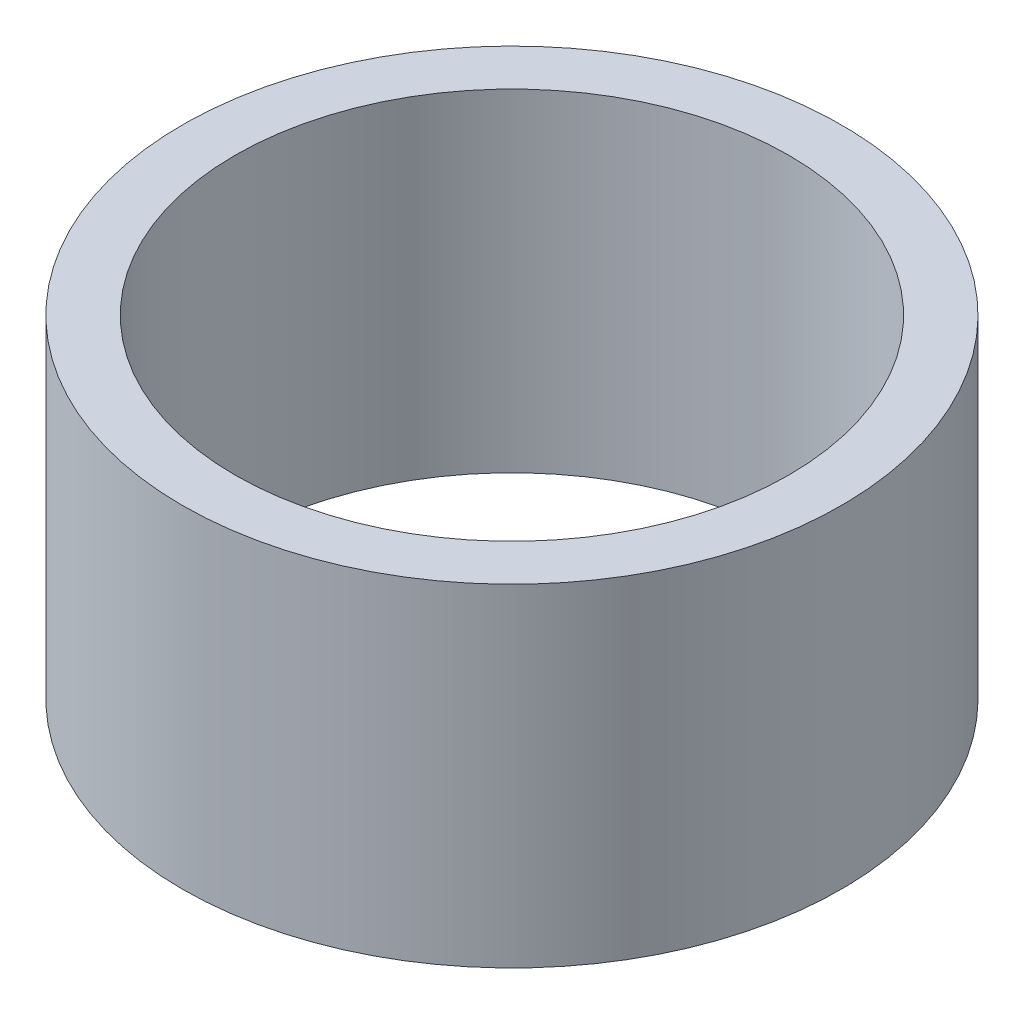
ISO-10303-21;
HEADER;
FILE_DESCRIPTION(('STEP AP214'),'2;1');
FILE_NAME('part.step','',(''),(''),'','','');
FILE_SCHEMA(('AUTOMOTIVE_DESIGN { 1 0 10303 214 1 1 1 1 }'));
ENDSEC;
DATA;
#1=APPLICATION_CONTEXT('core data for automotive mechanical design processes');
#2=APPLICATION_PROTOCOL_DEFINITION('international standard','automotive_design',2000,#1);
#3=PRODUCT_CONTEXT('',#1,'mechanical');
#4=PRODUCT('Part','Part','',(#3));
#5=PRODUCT_RELATED_PRODUCT_CATEGORY('part','',(#4));
#6=PRODUCT_DEFINITION_FORMATION('','',#4);
#7=PRODUCT_DEFINITION_CONTEXT('part definition',#1,'design');
#8=PRODUCT_DEFINITION('design','',#6,#7);
#9=PRODUCT_DEFINITION_SHAPE('','',#8);
#10=(LENGTH_UNIT() NAMED_UNIT(*) SI_UNIT(.MILLI.,.METRE.));
#11=(NAMED_UNIT(*) PLANE_ANGLE_UNIT() SI_UNIT($,.RADIAN.));
#12=(NAMED_UNIT(*) SI_UNIT($,.STERADIAN.) SOLID_ANGLE_UNIT());
#13=UNCERTAINTY_MEASURE_WITH_UNIT(LENGTH_MEASURE(1.E-05),#10,'distance_accuracy_value','');
#14=(GEOMETRIC_REPRESENTATION_CONTEXT(3) GLOBAL_UNCERTAINTY_ASSIGNED_CONTEXT((#13)) GLOBAL_UNIT_ASSIGNED_CONTEXT((#10,
#11,#12)) REPRESENTATION_CONTEXT('',''));
#15=CARTESIAN_POINT('',(0.,0.,0.));
#16=DIRECTION('',(0.,0.,1.));
#17=DIRECTION('',(1.,0.,0.));
#18=AXIS2_PLACEMENT_3D('',#15,#16,#17);
#19=CARTESIAN_POINT('',(0.,-76.2,0.));
#20=DIRECTION('',(0.,1.,0.));
#21=DIRECTION('',(0.,0.,1.));
#22=AXIS2_PLACEMENT_3D('',#19,#20,#21);
#23=CYLINDRICAL_SURFACE('',#22,75.565);
#24=CARTESIAN_POINT('',(0.,-76.2,0.));
#25=DIRECTION('',(0.,1.,0.));
#26=DIRECTION('',(0.,0.,1.));
#27=AXIS2_PLACEMENT_3D('',#24,#25,#26);
#28=CIRCLE('',#27,75.565);
#29=CARTESIAN_POINT('',(0.,-76.2,75.565));
#30=VERTEX_POINT('',#29);
#31=EDGE_CURVE('E10',#30,#30,#28,.T.);
#32=CARTESIAN_POINT('',(0.,0.,0.));
#33=DIRECTION('',(0.,1.,0.));
#34=DIRECTION('',(0.,0.,1.));
#35=AXIS2_PLACEMENT_3D('',#32,#33,#34);
#36=CIRCLE('',#35,75.565);
#37=CARTESIAN_POINT('',(0.,0.,75.565));
#38=VERTEX_POINT('',#37);
#39=EDGE_CURVE('E40',#38,#38,#36,.T.);
#40=CARTESIAN_POINT('',(0.,-76.2,75.565));
#41=CARTESIAN_POINT('',(0.,-75.40625,75.565));
#42=CARTESIAN_POINT('',(0.,-74.6125,75.565));
#43=CARTESIAN_POINT('',(0.,-73.025,75.565));
#44=CARTESIAN_POINT('',(0.,-72.23125,75.565));
#45=CARTESIAN_POINT('',(0.,-70.64375,75.565));
#46=CARTESIAN_POINT('',(0.,-69.85,75.565));
#47=CARTESIAN_POINT('',(0.,-68.2625,75.565));
#48=CARTESIAN_POINT('',(0.,-67.46875,75.565));
#49=CARTESIAN_POINT('',(0.,-65.88125,75.565));
#50=CARTESIAN_POINT('',(0.,-65.0875,75.565));
#51=CARTESIAN_POINT('',(0.,-63.5,75.565));
#52=CARTESIAN_POINT('',(0.,-62.70625,75.565));
#53=CARTESIAN_POINT('',(0.,-61.11875,75.565));
#54=CARTESIAN_POINT('',(0.,-60.325,75.565));
#55=CARTESIAN_POINT('',(0.,-58.7375,75.565));
#56=CARTESIAN_POINT('',(0.,-57.94375,75.565));
#57=CARTESIAN_POINT('',(0.,-56.35625,75.565));
#58=CARTESIAN_POINT('',(0.,-55.5625,75.565));
#59=CARTESIAN_POINT('',(0.,-53.975,75.565));
#60=CARTESIAN_POINT('',(0.,-53.18125,75.565));
#61=CARTESIAN_POINT('',(0.,-51.59375,75.565));
#62=CARTESIAN_POINT('',(0.,-50.8,75.565));
#63=CARTESIAN_POINT('',(0.,-49.2125,75.565));
#64=CARTESIAN_POINT('',(0.,-48.41875,75.565));
#65=CARTESIAN_POINT('',(0.,-46.83125,75.565));
#66=CARTESIAN_POINT('',(0.,-46.0375,75.565));
#67=CARTESIAN_POINT('',(0.,-44.45,75.565));
#68=CARTESIAN_POINT('',(0.,-43.65625,75.565));
#69=CARTESIAN_POINT('',(0.,-42.06875,75.565));
#70=CARTESIAN_POINT('',(0.,-41.275,75.565));
#71=CARTESIAN_POINT('',(0.,-39.6875,75.565));
#72=CARTESIAN_POINT('',(0.,-38.89375,75.565));
#73=CARTESIAN_POINT('',(0.,-37.30625,75.565));
#74=CARTESIAN_POINT('',(0.,-36.5125,75.565));
#75=CARTESIAN_POINT('',(0.,-34.925,75.565));
#76=CARTESIAN_POINT('',(0.,-34.13125,75.565));
#77=CARTESIAN_POINT('',(0.,-32.54375,75.565));
#78=CARTESIAN_POINT('',(0.,-31.75,75.565));
#79=CARTESIAN_POINT('',(0.,-30.1625,75.565));
#80=CARTESIAN_POINT('',(0.,-29.36875,75.565));
#81=CARTESIAN_POINT('',(0.,-27.78125,75.565));
#82=CARTESIAN_POINT('',(0.,-26.9875,75.565));
#83=CARTESIAN_POINT('',(0.,-25.4,75.565));
#84=CARTESIAN_POINT('',(0.,-24.60625,75.565));
#85=CARTESIAN_POINT('',(0.,-23.01875,75.565));
#86=CARTESIAN_POINT('',(0.,-22.225,75.565));
#87=CARTESIAN_POINT('',(0.,-20.6375,75.565));
#88=CARTESIAN_POINT('',(0.,-19.84375,75.565));
#89=CARTESIAN_POINT('',(0.,-18.25625,75.565));
#90=CARTESIAN_POINT('',(0.,-17.4625,75.565));
#91=CARTESIAN_POINT('',(0.,-15.875,75.565));
#92=CARTESIAN_POINT('',(0.,-15.08125,75.565));
#93=CARTESIAN_POINT('',(0.,-13.49375,75.565));
#94=CARTESIAN_POINT('',(0.,-12.7,75.565));
#95=CARTESIAN_POINT('',(0.,-11.1125,75.565));
#96=CARTESIAN_POINT('',(0.,-10.31875,75.565));
#97=CARTESIAN_POINT('',(0.,-8.73125,75.565));
#98=CARTESIAN_POINT('',(0.,-7.93750000000001,75.565));
#99=CARTESIAN_POINT('',(0.,-6.35,75.565));
#100=CARTESIAN_POINT('',(0.,-5.55625,75.565));
#101=CARTESIAN_POINT('',(0.,-3.96875,75.565));
#102=CARTESIAN_POINT('',(0.,-3.175,75.565));
#103=CARTESIAN_POINT('',(0.,-1.5875,75.565));
#104=CARTESIAN_POINT('',(0.,-0.793750000000001,75.565));
#105=CARTESIAN_POINT('',(0.,0.,75.565));
#106=B_SPLINE_CURVE_WITH_KNOTS('',3,(#40,#41,#42,#43,#44,#45,#46,#47,#48,#49,#50,#51,#52,#53,
#54,#55,#56,#57,#58,#59,#60,#61,#62,#63,#64,#65,#66,#67,#68,#69,#70,#71,#72,#73,#74,#75,#76,#77,
#78,#79,#80,#81,#82,#83,#84,#85,#86,#87,#88,#89,#90,#91,#92,#93,#94,#95,#96,#97,#98,#99,#100,
#101,#102,#103,#104,#105),.UNSPECIFIED.,.F.,.F.,(4,2,2,2,2,2,2,2,2,2,2,2,2,2,2,2,2,2,2,2,2,2,2,
2,2,2,2,2,2,2,2,2,4),(0.,2.38124999999999,4.76249999999999,7.14374999999999,9.52499999999999,
11.90625,14.2875,16.66875,19.05,21.43125,23.8125,26.19375,28.575,30.95625,33.3375,35.71875,38.1,
40.48125,42.8625,45.24375,47.625,50.00625,52.3875,54.76875,57.15,59.53125,61.9125,64.29375,
66.675,69.05625,71.4375,73.81875,76.2),.UNSPECIFIED.);
#107=EDGE_CURVE('BSEAM37',#30,#38,#106,.T.);
#108=ORIENTED_EDGE('',*,*,#31,.T.);
#109=ORIENTED_EDGE('',*,*,#39,.F.);
#110=ORIENTED_EDGE('',*,*,#107,.T.);
#111=ORIENTED_EDGE('',*,*,#107,.F.);
#112=EDGE_LOOP('',(#108,#110,#109,#111));
#113=FACE_BOUND('',#112,.T.);
#114=ADVANCED_FACE('F37',(#113),#23,.T.);
#115=CARTESIAN_POINT('',(0.,-76.2,0.));
#116=DIRECTION('',(0.,1.,0.));
#117=DIRECTION('',(0.,0.,1.));
#118=AXIS2_PLACEMENT_3D('',#115,#116,#117);
#119=PLANE('',#118);
#120=CARTESIAN_POINT('',(0.,-76.2,0.));
#121=DIRECTION('',(0.,1.,0.));
#122=DIRECTION('',(0.,0.,1.));
#123=AXIS2_PLACEMENT_3D('',#120,#121,#122);
#124=CIRCLE('',#123,63.5);
#125=CARTESIAN_POINT('',(0.,-76.2,63.5));
#126=VERTEX_POINT('',#125);
#127=EDGE_CURVE('E49',#126,#126,#124,.T.);
#128=ORIENTED_EDGE('',*,*,#127,.T.);
#129=EDGE_LOOP('',(#128));
#130=FACE_BOUND('',#129,.T.);
#131=ORIENTED_EDGE('',*,*,#31,.F.);
#132=EDGE_LOOP('',(#131));
#133=FACE_BOUND('',#132,.T.);
#134=ADVANCED_FACE('F59',(#130,#133),#119,.F.);
#135=CARTESIAN_POINT('',(0.,0.,0.));
#136=DIRECTION('',(0.,1.,0.));
#137=DIRECTION('',(0.,0.,1.));
#138=AXIS2_PLACEMENT_3D('',#135,#136,#137);
#139=PLANE('',#138);
#140=CARTESIAN_POINT('',(0.,0.,0.));
#141=DIRECTION('',(0.,1.,0.));
#142=DIRECTION('',(0.,0.,1.));
#143=AXIS2_PLACEMENT_3D('',#140,#141,#142);
#144=CIRCLE('',#143,63.5);
#145=CARTESIAN_POINT('',(0.,0.,63.5));
#146=VERTEX_POINT('',#145);
#147=EDGE_CURVE('E51',#146,#146,#144,.T.);
#148=ORIENTED_EDGE('',*,*,#147,.F.);
#149=EDGE_LOOP('',(#148));
#150=FACE_BOUND('',#149,.T.);
#151=ORIENTED_EDGE('',*,*,#39,.T.);
#152=EDGE_LOOP('',(#151));
#153=FACE_BOUND('',#152,.T.);
#154=ADVANCED_FACE('F65',(#150,#153),#139,.T.);
#155=CARTESIAN_POINT('',(0.,-76.2,0.));
#156=DIRECTION('',(0.,1.,0.));
#157=DIRECTION('',(0.,0.,1.));
#158=AXIS2_PLACEMENT_3D('',#155,#156,#157);
#159=CYLINDRICAL_SURFACE('',#158,63.5);
#160=CARTESIAN_POINT('',(0.,-76.2,63.5));
#161=CARTESIAN_POINT('',(0.,-75.40625,63.5));
#162=CARTESIAN_POINT('',(0.,-74.6125,63.5));
#163=CARTESIAN_POINT('',(0.,-73.025,63.5));
#164=CARTESIAN_POINT('',(0.,-72.23125,63.5));
#165=CARTESIAN_POINT('',(0.,-70.64375,63.5));
#166=CARTESIAN_POINT('',(0.,-69.85,63.5));
#167=CARTESIAN_POINT('',(0.,-68.2625,63.5));
#168=CARTESIAN_POINT('',(0.,-67.46875,63.5));
#169=CARTESIAN_POINT('',(0.,-65.88125,63.5));
#170=CARTESIAN_POINT('',(0.,-65.0875,63.5));
#171=CARTESIAN_POINT('',(0.,-63.5,63.5));
#172=CARTESIAN_POINT('',(0.,-62.70625,63.5));
#173=CARTESIAN_POINT('',(0.,-61.11875,63.5));
#174=CARTESIAN_POINT('',(0.,-60.325,63.5));
#175=CARTESIAN_POINT('',(0.,-58.7375,63.5));
#176=CARTESIAN_POINT('',(0.,-57.94375,63.5));
#177=CARTESIAN_POINT('',(0.,-56.35625,63.5));
#178=CARTESIAN_POINT('',(0.,-55.5625,63.5));
#179=CARTESIAN_POINT('',(0.,-53.975,63.5));
#180=CARTESIAN_POINT('',(0.,-53.18125,63.5));
#181=CARTESIAN_POINT('',(0.,-51.59375,63.5));
#182=CARTESIAN_POINT('',(0.,-50.8,63.5));
#183=CARTESIAN_POINT('',(0.,-49.2125,63.5));
#184=CARTESIAN_POINT('',(0.,-48.41875,63.5));
#185=CARTESIAN_POINT('',(0.,-46.83125,63.5));
#186=CARTESIAN_POINT('',(0.,-46.0375,63.5));
#187=CARTESIAN_POINT('',(0.,-44.45,63.5));
#188=CARTESIAN_POINT('',(0.,-43.65625,63.5));
#189=CARTESIAN_POINT('',(0.,-42.06875,63.5));
#190=CARTESIAN_POINT('',(0.,-41.275,63.5));
#191=CARTESIAN_POINT('',(0.,-39.6875,63.5));
#192=CARTESIAN_POINT('',(0.,-38.89375,63.5));
#193=CARTESIAN_POINT('',(0.,-37.30625,63.5));
#194=CARTESIAN_POINT('',(0.,-36.5125,63.5));
#195=CARTESIAN_POINT('',(0.,-34.925,63.5));
#196=CARTESIAN_POINT('',(0.,-34.13125,63.5));
#197=CARTESIAN_POINT('',(0.,-32.54375,63.5));
#198=CARTESIAN_POINT('',(0.,-31.75,63.5));
#199=CARTESIAN_POINT('',(0.,-30.1625,63.5));
#200=CARTESIAN_POINT('',(0.,-29.36875,63.5));
#201=CARTESIAN_POINT('',(0.,-27.78125,63.5));
#202=CARTESIAN_POINT('',(0.,-26.9875,63.5));
#203=CARTESIAN_POINT('',(0.,-25.4,63.5));
#204=CARTESIAN_POINT('',(0.,-24.60625,63.5));
#205=CARTESIAN_POINT('',(0.,-23.01875,63.5));
#206=CARTESIAN_POINT('',(0.,-22.225,63.5));
#207=CARTESIAN_POINT('',(0.,-20.6375,63.5));
#208=CARTESIAN_POINT('',(0.,-19.84375,63.5));
#209=CARTESIAN_POINT('',(0.,-18.25625,63.5));
#210=CARTESIAN_POINT('',(0.,-17.4625,63.5));
#211=CARTESIAN_POINT('',(0.,-15.875,63.5));
#212=CARTESIAN_POINT('',(0.,-15.08125,63.5));
#213=CARTESIAN_POINT('',(0.,-13.49375,63.5));
#214=CARTESIAN_POINT('',(0.,-12.7,63.5));
#215=CARTESIAN_POINT('',(0.,-11.1125,63.5));
#216=CARTESIAN_POINT('',(0.,-10.31875,63.5));
#217=CARTESIAN_POINT('',(0.,-8.73125,63.5));
#218=CARTESIAN_POINT('',(0.,-7.93750000000001,63.5));
#219=CARTESIAN_POINT('',(0.,-6.35,63.5));
#220=CARTESIAN_POINT('',(0.,-5.55625,63.5));
#221=CARTESIAN_POINT('',(0.,-3.96875,63.5));
#222=CARTESIAN_POINT('',(0.,-3.175,63.5));
#223=CARTESIAN_POINT('',(0.,-1.5875,63.5));
#224=CARTESIAN_POINT('',(0.,-0.793750000000001,63.5));
#225=CARTESIAN_POINT('',(0.,0.,63.5));
#226=B_SPLINE_CURVE_WITH_KNOTS('',3,(#160,#161,#162,#163,#164,#165,#166,#167,#168,#169,#170,
#171,#172,#173,#174,#175,#176,#177,#178,#179,#180,#181,#182,#183,#184,#185,#186,#187,#188,#189,
#190,#191,#192,#193,#194,#195,#196,#197,#198,#199,#200,#201,#202,#203,#204,#205,#206,#207,#208,
#209,#210,#211,#212,#213,#214,#215,#216,#217,#218,#219,#220,#221,#222,#223,#224,#225),
.UNSPECIFIED.,.F.,.F.,(4,2,2,2,2,2,2,2,2,2,2,2,2,2,2,2,2,2,2,2,2,2,2,2,2,2,2,2,2,2,2,2,4),(0.,
2.38124999999999,4.76249999999999,7.14374999999999,9.52499999999999,11.90625,14.2875,16.66875,
19.05,21.43125,23.8125,26.19375,28.575,30.95625,33.3375,35.71875,38.1,40.48125,42.8625,45.24375,
47.625,50.00625,52.3875,54.76875,57.15,59.53125,61.9125,64.29375,66.675,69.05625,71.4375,
73.81875,76.2),.UNSPECIFIED.);
#227=EDGE_CURVE('BSEAM62',#126,#146,#226,.T.);
#228=ORIENTED_EDGE('',*,*,#127,.F.);
#229=ORIENTED_EDGE('',*,*,#147,.T.);
#230=ORIENTED_EDGE('',*,*,#227,.T.);
#231=ORIENTED_EDGE('',*,*,#227,.F.);
#232=EDGE_LOOP('',(#228,#230,#229,#231));
#233=FACE_BOUND('',#232,.T.);
#234=ADVANCED_FACE('F62',(#233),#159,.F.);
#235=CLOSED_SHELL('',(#114,#134,#154,#234));
#236=MANIFOLD_SOLID_BREP('B2',#235);
#237=ADVANCED_BREP_SHAPE_REPRESENTATION('',(#18,#236),#14);
#238=SHAPE_DEFINITION_REPRESENTATION(#9,#237);
ENDSEC;
END-ISO-10303-21;
